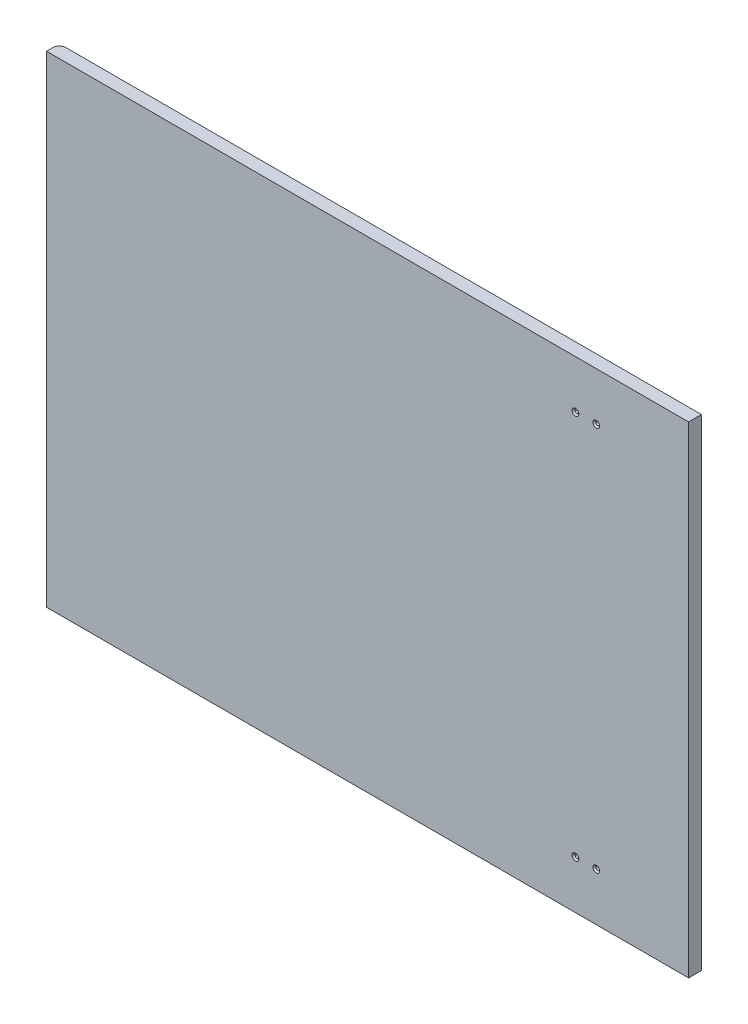
ISO-10303-21;
HEADER;
FILE_DESCRIPTION(('STEP AP214'),'2;1');
FILE_NAME('part.step','',(''),(''),'','','');
FILE_SCHEMA(('AUTOMOTIVE_DESIGN { 1 0 10303 214 1 1 1 1 }'));
ENDSEC;
DATA;
#1=APPLICATION_CONTEXT('core data for automotive mechanical design processes');
#2=APPLICATION_PROTOCOL_DEFINITION('international standard','automotive_design',2000,#1);
#3=PRODUCT_CONTEXT('',#1,'mechanical');
#4=PRODUCT('Part','Part','',(#3));
#5=PRODUCT_RELATED_PRODUCT_CATEGORY('part','',(#4));
#6=PRODUCT_DEFINITION_FORMATION('','',#4);
#7=PRODUCT_DEFINITION_CONTEXT('part definition',#1,'design');
#8=PRODUCT_DEFINITION('design','',#6,#7);
#9=PRODUCT_DEFINITION_SHAPE('','',#8);
#10=(LENGTH_UNIT() NAMED_UNIT(*) SI_UNIT(.MILLI.,.METRE.));
#11=(NAMED_UNIT(*) PLANE_ANGLE_UNIT() SI_UNIT($,.RADIAN.));
#12=(NAMED_UNIT(*) SI_UNIT($,.STERADIAN.) SOLID_ANGLE_UNIT());
#13=UNCERTAINTY_MEASURE_WITH_UNIT(LENGTH_MEASURE(1.E-05),#10,'distance_accuracy_value','');
#14=(GEOMETRIC_REPRESENTATION_CONTEXT(3) GLOBAL_UNCERTAINTY_ASSIGNED_CONTEXT((#13)) GLOBAL_UNIT_ASSIGNED_CONTEXT((#10,
#11,#12)) REPRESENTATION_CONTEXT('',''));
#15=CARTESIAN_POINT('',(0.,0.,0.));
#16=DIRECTION('',(0.,0.,1.));
#17=DIRECTION('',(1.,0.,0.));
#18=AXIS2_PLACEMENT_3D('',#15,#16,#17);
#19=CARTESIAN_POINT('',(0.,0.,16.));
#20=DIRECTION('',(0.,0.,-1.));
#21=DIRECTION('',(-1.,0.,0.));
#22=AXIS2_PLACEMENT_3D('',#19,#20,#21);
#23=PLANE('',#22);
#24=CARTESIAN_POINT('',(259.,240.,16.));
#25=DIRECTION('',(0.,0.,1.));
#26=DIRECTION('',(1.,0.,0.));
#27=AXIS2_PLACEMENT_3D('',#24,#25,#26);
#28=CIRCLE('',#27,4.21640000000001);
#29=CARTESIAN_POINT('',(263.2164,240.,16.));
#30=VERTEX_POINT('',#29);
#31=EDGE_CURVE('E139',#30,#30,#28,.T.);
#32=ORIENTED_EDGE('',*,*,#31,.F.);
#33=EDGE_LOOP('',(#32));
#34=FACE_BOUND('',#33,.T.);
#35=CARTESIAN_POINT('',(285.,-240.,16.));
#36=DIRECTION('',(0.,0.,1.));
#37=DIRECTION('',(1.,0.,0.));
#38=AXIS2_PLACEMENT_3D('',#35,#36,#37);
#39=CIRCLE('',#38,4.21640000000001);
#40=CARTESIAN_POINT('',(289.2164,-240.,16.));
#41=VERTEX_POINT('',#40);
#42=EDGE_CURVE('E135',#41,#41,#39,.T.);
#43=ORIENTED_EDGE('',*,*,#42,.F.);
#44=EDGE_LOOP('',(#43));
#45=FACE_BOUND('',#44,.T.);
#46=CARTESIAN_POINT('',(259.,-240.,16.));
#47=DIRECTION('',(0.,0.,1.));
#48=DIRECTION('',(1.,0.,0.));
#49=AXIS2_PLACEMENT_3D('',#46,#47,#48);
#50=CIRCLE('',#49,4.21640000000001);
#51=CARTESIAN_POINT('',(263.2164,-240.,16.));
#52=VERTEX_POINT('',#51);
#53=EDGE_CURVE('E130',#52,#52,#50,.T.);
#54=ORIENTED_EDGE('',*,*,#53,.F.);
#55=EDGE_LOOP('',(#54));
#56=FACE_BOUND('',#55,.T.);
#57=DIRECTION('',(0.,1.,0.));
#58=VECTOR('',#57,1.);
#59=CARTESIAN_POINT('',(400.,-300.,16.));
#60=LINE('',#59,#58);
#61=CARTESIAN_POINT('',(400.,-300.,16.));
#62=VERTEX_POINT('',#61);
#63=CARTESIAN_POINT('',(400.,300.,16.));
#64=VERTEX_POINT('',#63);
#65=EDGE_CURVE('E101',#62,#64,#60,.T.);
#66=ORIENTED_EDGE('',*,*,#65,.T.);
#67=DIRECTION('',(-1.,0.,0.));
#68=VECTOR('',#67,1.);
#69=CARTESIAN_POINT('',(-400.,300.,16.));
#70=LINE('',#69,#68);
#71=CARTESIAN_POINT('',(-400.,300.,16.));
#72=VERTEX_POINT('',#71);
#73=EDGE_CURVE('E90',#64,#72,#70,.T.);
#74=ORIENTED_EDGE('',*,*,#73,.T.);
#75=DIRECTION('',(0.,-1.,0.));
#76=VECTOR('',#75,1.);
#77=CARTESIAN_POINT('',(-400.,-300.,16.));
#78=LINE('',#77,#76);
#79=CARTESIAN_POINT('',(-400.,-300.,16.));
#80=VERTEX_POINT('',#79);
#81=EDGE_CURVE('E100',#72,#80,#78,.T.);
#82=ORIENTED_EDGE('',*,*,#81,.T.);
#83=DIRECTION('',(1.,0.,0.));
#84=VECTOR('',#83,1.);
#85=CARTESIAN_POINT('',(-400.,-300.,16.));
#86=LINE('',#85,#84);
#87=EDGE_CURVE('E106',#80,#62,#86,.T.);
#88=ORIENTED_EDGE('',*,*,#87,.T.);
#89=EDGE_LOOP('',(#66,#74,#82,#88));
#90=FACE_BOUND('',#89,.T.);
#91=CARTESIAN_POINT('',(285.,240.,16.));
#92=DIRECTION('',(0.,0.,1.));
#93=DIRECTION('',(1.,0.,0.));
#94=AXIS2_PLACEMENT_3D('',#91,#92,#93);
#95=CIRCLE('',#94,4.21640000000001);
#96=CARTESIAN_POINT('',(289.2164,240.,16.));
#97=VERTEX_POINT('',#96);
#98=EDGE_CURVE('E147',#97,#97,#95,.T.);
#99=ORIENTED_EDGE('',*,*,#98,.F.);
#100=EDGE_LOOP('',(#99));
#101=FACE_BOUND('',#100,.T.);
#102=ADVANCED_FACE('F45',(#34,#45,#56,#90,#101),#23,.F.);
#103=CARTESIAN_POINT('',(400.,-300.,16.));
#104=DIRECTION('',(-1.,0.,0.));
#105=DIRECTION('',(0.,0.,1.));
#106=AXIS2_PLACEMENT_3D('',#103,#104,#105);
#107=PLANE('',#106);
#108=DIRECTION('',(0.,1.,0.));
#109=VECTOR('',#108,1.);
#110=CARTESIAN_POINT('',(400.,-300.,0.));
#111=LINE('',#110,#109);
#112=CARTESIAN_POINT('',(400.,-300.,0.));
#113=VERTEX_POINT('',#112);
#114=CARTESIAN_POINT('',(400.,300.,0.));
#115=VERTEX_POINT('',#114);
#116=EDGE_CURVE('E114',#113,#115,#111,.T.);
#117=ORIENTED_EDGE('',*,*,#116,.T.);
#118=DIRECTION('',(0.,0.,-1.));
#119=VECTOR('',#118,1.);
#120=CARTESIAN_POINT('',(400.,300.,16.));
#121=LINE('',#120,#119);
#122=EDGE_CURVE('E94',#64,#115,#121,.T.);
#123=ORIENTED_EDGE('',*,*,#122,.F.);
#124=ORIENTED_EDGE('',*,*,#65,.F.);
#125=DIRECTION('',(0.,0.,-1.));
#126=VECTOR('',#125,1.);
#127=CARTESIAN_POINT('',(400.,-300.,16.));
#128=LINE('',#127,#126);
#129=EDGE_CURVE('E166',#62,#113,#128,.T.);
#130=ORIENTED_EDGE('',*,*,#129,.T.);
#131=EDGE_LOOP('',(#117,#123,#124,#130));
#132=FACE_BOUND('',#131,.T.);
#133=ADVANCED_FACE('F112',(#132),#107,.F.);
#134=CARTESIAN_POINT('',(-400.,300.,16.));
#135=DIRECTION('',(0.,-1.,0.));
#136=DIRECTION('',(0.,0.,-1.));
#137=AXIS2_PLACEMENT_3D('',#134,#135,#136);
#138=PLANE('',#137);
#139=DIRECTION('',(-1.,0.,0.));
#140=VECTOR('',#139,1.);
#141=CARTESIAN_POINT('',(-400.,300.,0.));
#142=LINE('',#141,#140);
#143=CARTESIAN_POINT('',(-392.,300.,0.));
#144=VERTEX_POINT('',#143);
#145=EDGE_CURVE('E168',#115,#144,#142,.T.);
#146=ORIENTED_EDGE('',*,*,#145,.T.);
#147=CARTESIAN_POINT('',(-392.,300.,8.));
#148=DIRECTION('',(0.,-1.,0.));
#149=DIRECTION('',(0.,0.,-1.));
#150=AXIS2_PLACEMENT_3D('',#147,#148,#149);
#151=CIRCLE('',#150,8.);
#152=CARTESIAN_POINT('',(-400.,300.,8.));
#153=VERTEX_POINT('',#152);
#154=EDGE_CURVE('E11',#144,#153,#151,.F.);
#155=ORIENTED_EDGE('',*,*,#154,.T.);
#156=DIRECTION('',(0.,0.,-1.));
#157=VECTOR('',#156,1.);
#158=CARTESIAN_POINT('',(-400.,300.,16.));
#159=LINE('',#158,#157);
#160=EDGE_CURVE('E97',#72,#153,#159,.T.);
#161=ORIENTED_EDGE('',*,*,#160,.F.);
#162=ORIENTED_EDGE('',*,*,#73,.F.);
#163=ORIENTED_EDGE('',*,*,#122,.T.);
#164=EDGE_LOOP('',(#146,#155,#161,#162,#163));
#165=FACE_BOUND('',#164,.T.);
#166=ADVANCED_FACE('F92',(#165),#138,.F.);
#167=CARTESIAN_POINT('',(-400.,-300.,16.));
#168=DIRECTION('',(1.,0.,0.));
#169=DIRECTION('',(0.,0.,-1.));
#170=AXIS2_PLACEMENT_3D('',#167,#168,#169);
#171=PLANE('',#170);
#172=ORIENTED_EDGE('',*,*,#160,.T.);
#173=DIRECTION('',(0.,-1.,0.));
#174=VECTOR('',#173,1.);
#175=CARTESIAN_POINT('',(-400.,-300.,8.));
#176=LINE('',#175,#174);
#177=CARTESIAN_POINT('',(-400.,-300.,8.));
#178=VERTEX_POINT('',#177);
#179=EDGE_CURVE('E115',#153,#178,#176,.T.);
#180=ORIENTED_EDGE('',*,*,#179,.T.);
#181=DIRECTION('',(0.,0.,-1.));
#182=VECTOR('',#181,1.);
#183=CARTESIAN_POINT('',(-400.,-300.,16.));
#184=LINE('',#183,#182);
#185=EDGE_CURVE('E119',#80,#178,#184,.T.);
#186=ORIENTED_EDGE('',*,*,#185,.F.);
#187=ORIENTED_EDGE('',*,*,#81,.F.);
#188=EDGE_LOOP('',(#172,#180,#186,#187));
#189=FACE_BOUND('',#188,.T.);
#190=ADVANCED_FACE('F174',(#189),#171,.F.);
#191=CARTESIAN_POINT('',(-400.,-300.,16.));
#192=DIRECTION('',(0.,1.,0.));
#193=DIRECTION('',(0.,0.,1.));
#194=AXIS2_PLACEMENT_3D('',#191,#192,#193);
#195=PLANE('',#194);
#196=ORIENTED_EDGE('',*,*,#185,.T.);
#197=CARTESIAN_POINT('',(-392.,-300.,8.));
#198=DIRECTION('',(0.,1.,0.));
#199=DIRECTION('',(0.,0.,1.));
#200=AXIS2_PLACEMENT_3D('',#197,#198,#199);
#201=CIRCLE('',#200,8.);
#202=CARTESIAN_POINT('',(-392.,-300.,0.));
#203=VERTEX_POINT('',#202);
#204=EDGE_CURVE('E67',#178,#203,#201,.F.);
#205=ORIENTED_EDGE('',*,*,#204,.T.);
#206=DIRECTION('',(1.,0.,0.));
#207=VECTOR('',#206,1.);
#208=CARTESIAN_POINT('',(-400.,-300.,0.));
#209=LINE('',#208,#207);
#210=EDGE_CURVE('E110',#203,#113,#209,.T.);
#211=ORIENTED_EDGE('',*,*,#210,.T.);
#212=ORIENTED_EDGE('',*,*,#129,.F.);
#213=ORIENTED_EDGE('',*,*,#87,.F.);
#214=EDGE_LOOP('',(#196,#205,#211,#212,#213));
#215=FACE_BOUND('',#214,.T.);
#216=ADVANCED_FACE('F172',(#215),#195,.F.);
#217=CARTESIAN_POINT('',(0.,0.,0.));
#218=DIRECTION('',(0.,0.,-1.));
#219=DIRECTION('',(-1.,0.,0.));
#220=AXIS2_PLACEMENT_3D('',#217,#218,#219);
#221=PLANE('',#220);
#222=CARTESIAN_POINT('',(285.,240.,0.));
#223=DIRECTION('',(0.,0.,-1.));
#224=DIRECTION('',(-1.,0.,0.));
#225=AXIS2_PLACEMENT_3D('',#222,#223,#224);
#226=CIRCLE('',#225,2.24789999999997);
#227=CARTESIAN_POINT('',(282.7521,240.,0.));
#228=VERTEX_POINT('',#227);
#229=EDGE_CURVE('E137',#228,#228,#226,.T.);
#230=ORIENTED_EDGE('',*,*,#229,.F.);
#231=EDGE_LOOP('',(#230));
#232=FACE_BOUND('',#231,.T.);
#233=CARTESIAN_POINT('',(259.,240.,0.));
#234=DIRECTION('',(0.,0.,-1.));
#235=DIRECTION('',(-1.,0.,0.));
#236=AXIS2_PLACEMENT_3D('',#233,#234,#235);
#237=CIRCLE('',#236,2.24789999999997);
#238=CARTESIAN_POINT('',(256.7521,240.,0.));
#239=VERTEX_POINT('',#238);
#240=EDGE_CURVE('E132',#239,#239,#237,.T.);
#241=ORIENTED_EDGE('',*,*,#240,.F.);
#242=EDGE_LOOP('',(#241));
#243=FACE_BOUND('',#242,.T.);
#244=CARTESIAN_POINT('',(285.,-240.,0.));
#245=DIRECTION('',(0.,0.,-1.));
#246=DIRECTION('',(-1.,0.,0.));
#247=AXIS2_PLACEMENT_3D('',#244,#245,#246);
#248=CIRCLE('',#247,2.24789999999997);
#249=CARTESIAN_POINT('',(282.7521,-240.,0.));
#250=VERTEX_POINT('',#249);
#251=EDGE_CURVE('E127',#250,#250,#248,.T.);
#252=ORIENTED_EDGE('',*,*,#251,.F.);
#253=EDGE_LOOP('',(#252));
#254=FACE_BOUND('',#253,.T.);
#255=CARTESIAN_POINT('',(259.,-240.,0.));
#256=DIRECTION('',(0.,0.,-1.));
#257=DIRECTION('',(-1.,0.,0.));
#258=AXIS2_PLACEMENT_3D('',#255,#256,#257);
#259=CIRCLE('',#258,2.24789999999997);
#260=CARTESIAN_POINT('',(256.7521,-240.,0.));
#261=VERTEX_POINT('',#260);
#262=EDGE_CURVE('E123',#261,#261,#259,.T.);
#263=ORIENTED_EDGE('',*,*,#262,.F.);
#264=EDGE_LOOP('',(#263));
#265=FACE_BOUND('',#264,.T.);
#266=ORIENTED_EDGE('',*,*,#210,.F.);
#267=DIRECTION('',(0.,-1.,0.));
#268=VECTOR('',#267,1.);
#269=CARTESIAN_POINT('',(-392.,300.,0.));
#270=LINE('',#269,#268);
#271=EDGE_CURVE('E53',#203,#144,#270,.F.);
#272=ORIENTED_EDGE('',*,*,#271,.T.);
#273=ORIENTED_EDGE('',*,*,#145,.F.);
#274=ORIENTED_EDGE('',*,*,#116,.F.);
#275=EDGE_LOOP('',(#266,#272,#273,#274));
#276=FACE_BOUND('',#275,.T.);
#277=ADVANCED_FACE('F178',(#232,#243,#254,#265,#276),#221,.T.);
#278=CARTESIAN_POINT('',(259.,-240.,16.));
#279=DIRECTION('',(0.,0.,1.));
#280=DIRECTION('',(1.,0.,0.));
#281=AXIS2_PLACEMENT_3D('',#278,#279,#280);
#282=CYLINDRICAL_SURFACE('',#281,2.24789999999997);
#283=ORIENTED_EDGE('',*,*,#262,.T.);
#284=EDGE_LOOP('',(#283));
#285=FACE_BOUND('',#284,.T.);
#286=CARTESIAN_POINT('',(259.,-240.,14.3482323760275));
#287=DIRECTION('',(0.,0.,1.));
#288=DIRECTION('',(1.,0.,0.));
#289=AXIS2_PLACEMENT_3D('',#286,#287,#288);
#290=CIRCLE('',#289,2.24789999999997);
#291=CARTESIAN_POINT('',(261.2479,-240.,14.3482323760275));
#292=VERTEX_POINT('',#291);
#293=EDGE_CURVE('E126',#292,#292,#290,.T.);
#294=ORIENTED_EDGE('',*,*,#293,.T.);
#295=EDGE_LOOP('',(#294));
#296=FACE_BOUND('',#295,.T.);
#297=ADVANCED_FACE('F180',(#285,#296),#282,.F.);
#298=CARTESIAN_POINT('',(259.,-240.,16.));
#299=DIRECTION('',(0.,0.,1.));
#300=DIRECTION('',(1.,0.,0.));
#301=AXIS2_PLACEMENT_3D('',#298,#299,#300);
#302=CONICAL_SURFACE('',#301,4.21640000000001,0.872664625997172);
#303=ORIENTED_EDGE('',*,*,#293,.F.);
#304=EDGE_LOOP('',(#303));
#305=FACE_BOUND('',#304,.T.);
#306=ORIENTED_EDGE('',*,*,#53,.T.);
#307=EDGE_LOOP('',(#306));
#308=FACE_BOUND('',#307,.T.);
#309=ADVANCED_FACE('F188',(#305,#308),#302,.F.);
#310=CARTESIAN_POINT('',(285.,-240.,16.));
#311=DIRECTION('',(0.,0.,1.));
#312=DIRECTION('',(1.,0.,0.));
#313=AXIS2_PLACEMENT_3D('',#310,#311,#312);
#314=CYLINDRICAL_SURFACE('',#313,2.24789999999997);
#315=ORIENTED_EDGE('',*,*,#251,.T.);
#316=EDGE_LOOP('',(#315));
#317=FACE_BOUND('',#316,.T.);
#318=CARTESIAN_POINT('',(285.,-240.,14.3482323760275));
#319=DIRECTION('',(0.,0.,1.));
#320=DIRECTION('',(1.,0.,0.));
#321=AXIS2_PLACEMENT_3D('',#318,#319,#320);
#322=CIRCLE('',#321,2.24789999999997);
#323=CARTESIAN_POINT('',(287.2479,-240.,14.3482323760275));
#324=VERTEX_POINT('',#323);
#325=EDGE_CURVE('E131',#324,#324,#322,.T.);
#326=ORIENTED_EDGE('',*,*,#325,.T.);
#327=EDGE_LOOP('',(#326));
#328=FACE_BOUND('',#327,.T.);
#329=ADVANCED_FACE('F206',(#317,#328),#314,.F.);
#330=CARTESIAN_POINT('',(285.,-240.,16.));
#331=DIRECTION('',(0.,0.,1.));
#332=DIRECTION('',(1.,0.,0.));
#333=AXIS2_PLACEMENT_3D('',#330,#331,#332);
#334=CONICAL_SURFACE('',#333,4.21640000000001,0.872664625997172);
#335=ORIENTED_EDGE('',*,*,#325,.F.);
#336=EDGE_LOOP('',(#335));
#337=FACE_BOUND('',#336,.T.);
#338=ORIENTED_EDGE('',*,*,#42,.T.);
#339=EDGE_LOOP('',(#338));
#340=FACE_BOUND('',#339,.T.);
#341=ADVANCED_FACE('F210',(#337,#340),#334,.F.);
#342=CARTESIAN_POINT('',(259.,240.,16.));
#343=DIRECTION('',(0.,0.,1.));
#344=DIRECTION('',(1.,0.,0.));
#345=AXIS2_PLACEMENT_3D('',#342,#343,#344);
#346=CYLINDRICAL_SURFACE('',#345,2.24789999999997);
#347=ORIENTED_EDGE('',*,*,#240,.T.);
#348=EDGE_LOOP('',(#347));
#349=FACE_BOUND('',#348,.T.);
#350=CARTESIAN_POINT('',(259.,240.,14.3482323760275));
#351=DIRECTION('',(0.,0.,1.));
#352=DIRECTION('',(1.,0.,0.));
#353=AXIS2_PLACEMENT_3D('',#350,#351,#352);
#354=CIRCLE('',#353,2.24789999999997);
#355=CARTESIAN_POINT('',(261.2479,240.,14.3482323760275));
#356=VERTEX_POINT('',#355);
#357=EDGE_CURVE('E136',#356,#356,#354,.T.);
#358=ORIENTED_EDGE('',*,*,#357,.T.);
#359=EDGE_LOOP('',(#358));
#360=FACE_BOUND('',#359,.T.);
#361=ADVANCED_FACE('F213',(#349,#360),#346,.F.);
#362=CARTESIAN_POINT('',(259.,240.,16.));
#363=DIRECTION('',(0.,0.,1.));
#364=DIRECTION('',(1.,0.,0.));
#365=AXIS2_PLACEMENT_3D('',#362,#363,#364);
#366=CONICAL_SURFACE('',#365,4.21640000000001,0.872664625997172);
#367=ORIENTED_EDGE('',*,*,#357,.F.);
#368=EDGE_LOOP('',(#367));
#369=FACE_BOUND('',#368,.T.);
#370=ORIENTED_EDGE('',*,*,#31,.T.);
#371=EDGE_LOOP('',(#370));
#372=FACE_BOUND('',#371,.T.);
#373=ADVANCED_FACE('F216',(#369,#372),#366,.F.);
#374=CARTESIAN_POINT('',(285.,240.,16.));
#375=DIRECTION('',(0.,0.,1.));
#376=DIRECTION('',(1.,0.,0.));
#377=AXIS2_PLACEMENT_3D('',#374,#375,#376);
#378=CYLINDRICAL_SURFACE('',#377,2.24789999999997);
#379=ORIENTED_EDGE('',*,*,#229,.T.);
#380=EDGE_LOOP('',(#379));
#381=FACE_BOUND('',#380,.T.);
#382=CARTESIAN_POINT('',(285.,240.,14.3482323760275));
#383=DIRECTION('',(0.,0.,1.));
#384=DIRECTION('',(1.,0.,0.));
#385=AXIS2_PLACEMENT_3D('',#382,#383,#384);
#386=CIRCLE('',#385,2.24789999999997);
#387=CARTESIAN_POINT('',(287.2479,240.,14.3482323760275));
#388=VERTEX_POINT('',#387);
#389=EDGE_CURVE('E140',#388,#388,#386,.T.);
#390=ORIENTED_EDGE('',*,*,#389,.T.);
#391=EDGE_LOOP('',(#390));
#392=FACE_BOUND('',#391,.T.);
#393=ADVANCED_FACE('F220',(#381,#392),#378,.F.);
#394=CARTESIAN_POINT('',(285.,240.,16.));
#395=DIRECTION('',(0.,0.,1.));
#396=DIRECTION('',(1.,0.,0.));
#397=AXIS2_PLACEMENT_3D('',#394,#395,#396);
#398=CONICAL_SURFACE('',#397,4.21640000000001,0.872664625997172);
#399=ORIENTED_EDGE('',*,*,#389,.F.);
#400=EDGE_LOOP('',(#399));
#401=FACE_BOUND('',#400,.T.);
#402=ORIENTED_EDGE('',*,*,#98,.T.);
#403=EDGE_LOOP('',(#402));
#404=FACE_BOUND('',#403,.T.);
#405=ADVANCED_FACE('F224',(#401,#404),#398,.F.);
#406=CARTESIAN_POINT('',(-392.,-300.,8.));
#407=DIRECTION('',(0.,1.,0.));
#408=DIRECTION('',(0.,0.,1.));
#409=AXIS2_PLACEMENT_3D('',#406,#407,#408);
#410=CYLINDRICAL_SURFACE('',#409,8.);
#411=ORIENTED_EDGE('',*,*,#154,.F.);
#412=ORIENTED_EDGE('',*,*,#271,.F.);
#413=ORIENTED_EDGE('',*,*,#204,.F.);
#414=ORIENTED_EDGE('',*,*,#179,.F.);
#415=EDGE_LOOP('',(#411,#412,#413,#414));
#416=FACE_BOUND('',#415,.T.);
#417=ADVANCED_FACE('F47',(#416),#410,.T.);
#418=CLOSED_SHELL('',(#102,#133,#166,#190,#216,#277,#297,#309,#329,#341,#361,#373,#393,#405,#417));
#419=MANIFOLD_SOLID_BREP('B2',#418);
#420=ADVANCED_BREP_SHAPE_REPRESENTATION('',(#18,#419),#14);
#421=SHAPE_DEFINITION_REPRESENTATION(#9,#420);
ENDSEC;
END-ISO-10303-21;
